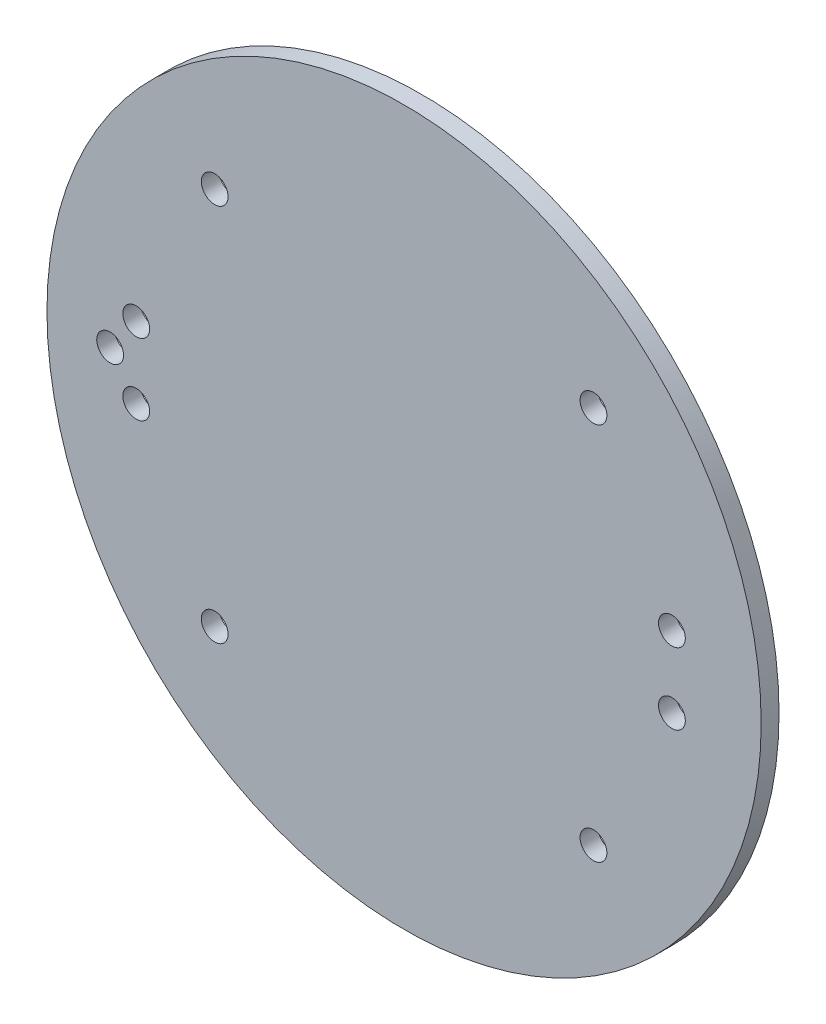
ISO-10303-21;
HEADER;
FILE_DESCRIPTION(('STEP AP214'),'2;1');
FILE_NAME('part.step','',(''),(''),'','','');
FILE_SCHEMA(('AUTOMOTIVE_DESIGN { 1 0 10303 214 1 1 1 1 }'));
ENDSEC;
DATA;
#1=APPLICATION_CONTEXT('core data for automotive mechanical design processes');
#2=APPLICATION_PROTOCOL_DEFINITION('international standard','automotive_design',2000,#1);
#3=PRODUCT_CONTEXT('',#1,'mechanical');
#4=PRODUCT('Part','Part','',(#3));
#5=PRODUCT_RELATED_PRODUCT_CATEGORY('part','',(#4));
#6=PRODUCT_DEFINITION_FORMATION('','',#4);
#7=PRODUCT_DEFINITION_CONTEXT('part definition',#1,'design');
#8=PRODUCT_DEFINITION('design','',#6,#7);
#9=PRODUCT_DEFINITION_SHAPE('','',#8);
#10=(LENGTH_UNIT() NAMED_UNIT(*) SI_UNIT(.MILLI.,.METRE.));
#11=(NAMED_UNIT(*) PLANE_ANGLE_UNIT() SI_UNIT($,.RADIAN.));
#12=(NAMED_UNIT(*) SI_UNIT($,.STERADIAN.) SOLID_ANGLE_UNIT());
#13=UNCERTAINTY_MEASURE_WITH_UNIT(LENGTH_MEASURE(1.E-05),#10,'distance_accuracy_value','');
#14=(GEOMETRIC_REPRESENTATION_CONTEXT(3) GLOBAL_UNCERTAINTY_ASSIGNED_CONTEXT((#13)) GLOBAL_UNIT_ASSIGNED_CONTEXT((#10,
#11,#12)) REPRESENTATION_CONTEXT('',''));
#15=CARTESIAN_POINT('',(0.,0.,0.));
#16=DIRECTION('',(0.,0.,1.));
#17=DIRECTION('',(1.,0.,0.));
#18=AXIS2_PLACEMENT_3D('',#15,#16,#17);
#19=CARTESIAN_POINT('',(0.,0.,6.35));
#20=DIRECTION('',(0.,0.,-1.));
#21=DIRECTION('',(-1.,0.,0.));
#22=AXIS2_PLACEMENT_3D('',#19,#20,#21);
#23=CYLINDRICAL_SURFACE('',#22,127.);
#24=CARTESIAN_POINT('',(0.,0.,6.35));
#25=DIRECTION('',(0.,0.,1.));
#26=DIRECTION('',(1.,0.,0.));
#27=AXIS2_PLACEMENT_3D('',#24,#25,#26);
#28=CIRCLE('',#27,127.);
#29=CARTESIAN_POINT('',(127.,0.,6.35));
#30=VERTEX_POINT('',#29);
#31=EDGE_CURVE('E10',#30,#30,#28,.T.);
#32=ORIENTED_EDGE('',*,*,#31,.F.);
#33=EDGE_LOOP('',(#32));
#34=FACE_BOUND('',#33,.T.);
#35=CARTESIAN_POINT('',(0.,0.,0.));
#36=DIRECTION('',(0.,0.,1.));
#37=DIRECTION('',(1.,0.,0.));
#38=AXIS2_PLACEMENT_3D('',#35,#36,#37);
#39=CIRCLE('',#38,127.);
#40=CARTESIAN_POINT('',(127.,0.,0.));
#41=VERTEX_POINT('',#40);
#42=EDGE_CURVE('E33',#41,#41,#39,.T.);
#43=ORIENTED_EDGE('',*,*,#42,.T.);
#44=EDGE_LOOP('',(#43));
#45=FACE_BOUND('',#44,.T.);
#46=ADVANCED_FACE('F30',(#34,#45),#23,.T.);
#47=CARTESIAN_POINT('',(0.,0.,6.35));
#48=DIRECTION('',(0.,0.,1.));
#49=DIRECTION('',(1.,0.,0.));
#50=AXIS2_PLACEMENT_3D('',#47,#48,#49);
#51=PLANE('',#50);
#52=CARTESIAN_POINT('',(-104.537500094,0.,6.35));
#53=DIRECTION('',(0.,0.,1.));
#54=DIRECTION('',(1.,0.,0.));
#55=AXIS2_PLACEMENT_3D('',#52,#53,#54);
#56=CIRCLE('',#55,4.7625);
#57=CARTESIAN_POINT('',(-99.775000094,0.,6.35));
#58=VERTEX_POINT('',#57);
#59=EDGE_CURVE('E85',#58,#58,#56,.T.);
#60=ORIENTED_EDGE('',*,*,#59,.F.);
#61=EDGE_LOOP('',(#60));
#62=FACE_BOUND('',#61,.T.);
#63=CARTESIAN_POINT('',(95.25,12.7,6.35));
#64=DIRECTION('',(0.,0.,1.));
#65=DIRECTION('',(1.,0.,0.));
#66=AXIS2_PLACEMENT_3D('',#63,#64,#65);
#67=CIRCLE('',#66,4.7625);
#68=CARTESIAN_POINT('',(100.0125,12.7,6.35));
#69=VERTEX_POINT('',#68);
#70=EDGE_CURVE('E61',#69,#69,#67,.T.);
#71=ORIENTED_EDGE('',*,*,#70,.F.);
#72=EDGE_LOOP('',(#71));
#73=FACE_BOUND('',#72,.T.);
#74=CARTESIAN_POINT('',(95.25,-12.7,6.35));
#75=DIRECTION('',(0.,0.,1.));
#76=DIRECTION('',(1.,0.,0.));
#77=AXIS2_PLACEMENT_3D('',#74,#75,#76);
#78=CIRCLE('',#77,4.7625);
#79=CARTESIAN_POINT('',(100.0125,-12.7,6.35));
#80=VERTEX_POINT('',#79);
#81=EDGE_CURVE('E68',#80,#80,#78,.T.);
#82=ORIENTED_EDGE('',*,*,#81,.F.);
#83=EDGE_LOOP('',(#82));
#84=FACE_BOUND('',#83,.T.);
#85=CARTESIAN_POINT('',(-95.25,-12.7,6.35));
#86=DIRECTION('',(0.,0.,1.));
#87=DIRECTION('',(1.,0.,0.));
#88=AXIS2_PLACEMENT_3D('',#85,#86,#87);
#89=CIRCLE('',#88,4.7625);
#90=CARTESIAN_POINT('',(-90.4875,-12.7,6.35));
#91=VERTEX_POINT('',#90);
#92=EDGE_CURVE('E71',#91,#91,#89,.T.);
#93=ORIENTED_EDGE('',*,*,#92,.F.);
#94=EDGE_LOOP('',(#93));
#95=FACE_BOUND('',#94,.T.);
#96=CARTESIAN_POINT('',(-95.25,12.7,6.35));
#97=DIRECTION('',(0.,0.,1.));
#98=DIRECTION('',(1.,0.,0.));
#99=AXIS2_PLACEMENT_3D('',#96,#97,#98);
#100=CIRCLE('',#99,4.7625);
#101=CARTESIAN_POINT('',(-90.4875,12.7,6.35));
#102=VERTEX_POINT('',#101);
#103=EDGE_CURVE('E74',#102,#102,#100,.T.);
#104=ORIENTED_EDGE('',*,*,#103,.F.);
#105=EDGE_LOOP('',(#104));
#106=FACE_BOUND('',#105,.T.);
#107=CARTESIAN_POINT('',(67.3519209080187,67.3519209080186,6.35));
#108=DIRECTION('',(0.,0.,1.));
#109=DIRECTION('',(1.,0.,0.));
#110=AXIS2_PLACEMENT_3D('',#107,#108,#109);
#111=CIRCLE('',#110,4.7625);
#112=CARTESIAN_POINT('',(72.1144209080186,67.3519209080186,6.35));
#113=VERTEX_POINT('',#112);
#114=EDGE_CURVE('E40',#113,#113,#111,.T.);
#115=ORIENTED_EDGE('',*,*,#114,.F.);
#116=EDGE_LOOP('',(#115));
#117=FACE_BOUND('',#116,.T.);
#118=CARTESIAN_POINT('',(67.3519209080187,-67.3519209080186,6.35));
#119=DIRECTION('',(0.,0.,1.));
#120=DIRECTION('',(1.,0.,0.));
#121=AXIS2_PLACEMENT_3D('',#118,#119,#120);
#122=CIRCLE('',#121,4.7625);
#123=CARTESIAN_POINT('',(72.1144209080186,-67.3519209080186,6.35));
#124=VERTEX_POINT('',#123);
#125=EDGE_CURVE('E44',#124,#124,#122,.T.);
#126=ORIENTED_EDGE('',*,*,#125,.F.);
#127=EDGE_LOOP('',(#126));
#128=FACE_BOUND('',#127,.T.);
#129=CARTESIAN_POINT('',(-67.3519209080187,-67.3519209080186,6.35));
#130=DIRECTION('',(0.,0.,1.));
#131=DIRECTION('',(1.,0.,0.));
#132=AXIS2_PLACEMENT_3D('',#129,#130,#131);
#133=CIRCLE('',#132,4.7625);
#134=CARTESIAN_POINT('',(-62.5894209080187,-67.3519209080186,6.35));
#135=VERTEX_POINT('',#134);
#136=EDGE_CURVE('E47',#135,#135,#133,.T.);
#137=ORIENTED_EDGE('',*,*,#136,.F.);
#138=EDGE_LOOP('',(#137));
#139=FACE_BOUND('',#138,.T.);
#140=CARTESIAN_POINT('',(-67.3519209080187,67.3519209080186,6.35));
#141=DIRECTION('',(0.,0.,1.));
#142=DIRECTION('',(1.,0.,0.));
#143=AXIS2_PLACEMENT_3D('',#140,#141,#142);
#144=CIRCLE('',#143,4.7625);
#145=CARTESIAN_POINT('',(-62.5894209080187,67.3519209080186,6.35));
#146=VERTEX_POINT('',#145);
#147=EDGE_CURVE('E50',#146,#146,#144,.T.);
#148=ORIENTED_EDGE('',*,*,#147,.F.);
#149=EDGE_LOOP('',(#148));
#150=FACE_BOUND('',#149,.T.);
#151=ORIENTED_EDGE('',*,*,#31,.T.);
#152=EDGE_LOOP('',(#151));
#153=FACE_BOUND('',#152,.T.);
#154=ADVANCED_FACE('F112',(#62,#73,#84,#95,#106,#117,#128,#139,#150,#153),#51,.T.);
#155=CARTESIAN_POINT('',(0.,0.,0.));
#156=DIRECTION('',(0.,0.,1.));
#157=DIRECTION('',(1.,0.,0.));
#158=AXIS2_PLACEMENT_3D('',#155,#156,#157);
#159=PLANE('',#158);
#160=CARTESIAN_POINT('',(-104.537500094,0.,0.));
#161=DIRECTION('',(0.,0.,1.));
#162=DIRECTION('',(1.,0.,0.));
#163=AXIS2_PLACEMENT_3D('',#160,#161,#162);
#164=CIRCLE('',#163,4.7625);
#165=CARTESIAN_POINT('',(-99.775000094,0.,0.));
#166=VERTEX_POINT('',#165);
#167=EDGE_CURVE('E92',#166,#166,#164,.T.);
#168=ORIENTED_EDGE('',*,*,#167,.T.);
#169=EDGE_LOOP('',(#168));
#170=FACE_BOUND('',#169,.T.);
#171=CARTESIAN_POINT('',(95.25,12.7,0.));
#172=DIRECTION('',(0.,0.,1.));
#173=DIRECTION('',(-1.,0.,0.));
#174=AXIS2_PLACEMENT_3D('',#171,#172,#173);
#175=CIRCLE('',#174,4.7625);
#176=CARTESIAN_POINT('',(90.4875,12.7,0.));
#177=VERTEX_POINT('',#176);
#178=EDGE_CURVE('E81',#177,#177,#175,.T.);
#179=ORIENTED_EDGE('',*,*,#178,.T.);
#180=EDGE_LOOP('',(#179));
#181=FACE_BOUND('',#180,.T.);
#182=CARTESIAN_POINT('',(95.25,-12.7,0.));
#183=DIRECTION('',(0.,0.,1.));
#184=DIRECTION('',(1.,0.,0.));
#185=AXIS2_PLACEMENT_3D('',#182,#183,#184);
#186=CIRCLE('',#185,4.7625);
#187=CARTESIAN_POINT('',(100.0125,-12.7,0.));
#188=VERTEX_POINT('',#187);
#189=EDGE_CURVE('E84',#188,#188,#186,.T.);
#190=ORIENTED_EDGE('',*,*,#189,.T.);
#191=EDGE_LOOP('',(#190));
#192=FACE_BOUND('',#191,.T.);
#193=CARTESIAN_POINT('',(-95.25,-12.7,0.));
#194=DIRECTION('',(0.,0.,1.));
#195=DIRECTION('',(-1.,0.,0.));
#196=AXIS2_PLACEMENT_3D('',#193,#194,#195);
#197=CIRCLE('',#196,4.7625);
#198=CARTESIAN_POINT('',(-100.0125,-12.7,0.));
#199=VERTEX_POINT('',#198);
#200=EDGE_CURVE('E80',#199,#199,#197,.T.);
#201=ORIENTED_EDGE('',*,*,#200,.T.);
#202=EDGE_LOOP('',(#201));
#203=FACE_BOUND('',#202,.T.);
#204=CARTESIAN_POINT('',(-95.25,12.7,0.));
#205=DIRECTION('',(0.,0.,1.));
#206=DIRECTION('',(1.,0.,0.));
#207=AXIS2_PLACEMENT_3D('',#204,#205,#206);
#208=CIRCLE('',#207,4.7625);
#209=CARTESIAN_POINT('',(-90.4875,12.7,0.));
#210=VERTEX_POINT('',#209);
#211=EDGE_CURVE('E77',#210,#210,#208,.T.);
#212=ORIENTED_EDGE('',*,*,#211,.T.);
#213=EDGE_LOOP('',(#212));
#214=FACE_BOUND('',#213,.T.);
#215=CARTESIAN_POINT('',(67.3519209080187,67.3519209080186,0.));
#216=DIRECTION('',(0.,0.,1.));
#217=DIRECTION('',(-1.,0.,0.));
#218=AXIS2_PLACEMENT_3D('',#215,#216,#217);
#219=CIRCLE('',#218,4.7625);
#220=CARTESIAN_POINT('',(62.5894209080187,67.3519209080186,0.));
#221=VERTEX_POINT('',#220);
#222=EDGE_CURVE('E57',#221,#221,#219,.T.);
#223=ORIENTED_EDGE('',*,*,#222,.T.);
#224=EDGE_LOOP('',(#223));
#225=FACE_BOUND('',#224,.T.);
#226=CARTESIAN_POINT('',(67.3519209080187,-67.3519209080186,0.));
#227=DIRECTION('',(0.,0.,1.));
#228=DIRECTION('',(1.,0.,0.));
#229=AXIS2_PLACEMENT_3D('',#226,#227,#228);
#230=CIRCLE('',#229,4.7625);
#231=CARTESIAN_POINT('',(72.1144209080186,-67.3519209080186,0.));
#232=VERTEX_POINT('',#231);
#233=EDGE_CURVE('E60',#232,#232,#230,.T.);
#234=ORIENTED_EDGE('',*,*,#233,.T.);
#235=EDGE_LOOP('',(#234));
#236=FACE_BOUND('',#235,.T.);
#237=CARTESIAN_POINT('',(-67.3519209080187,-67.3519209080186,0.));
#238=DIRECTION('',(0.,0.,1.));
#239=DIRECTION('',(-1.,0.,0.));
#240=AXIS2_PLACEMENT_3D('',#237,#238,#239);
#241=CIRCLE('',#240,4.7625);
#242=CARTESIAN_POINT('',(-72.1144209080186,-67.3519209080186,0.));
#243=VERTEX_POINT('',#242);
#244=EDGE_CURVE('E56',#243,#243,#241,.T.);
#245=ORIENTED_EDGE('',*,*,#244,.T.);
#246=EDGE_LOOP('',(#245));
#247=FACE_BOUND('',#246,.T.);
#248=CARTESIAN_POINT('',(-67.3519209080187,67.3519209080186,0.));
#249=DIRECTION('',(0.,0.,1.));
#250=DIRECTION('',(1.,0.,0.));
#251=AXIS2_PLACEMENT_3D('',#248,#249,#250);
#252=CIRCLE('',#251,4.7625);
#253=CARTESIAN_POINT('',(-62.5894209080187,67.3519209080186,0.));
#254=VERTEX_POINT('',#253);
#255=EDGE_CURVE('E53',#254,#254,#252,.T.);
#256=ORIENTED_EDGE('',*,*,#255,.T.);
#257=EDGE_LOOP('',(#256));
#258=FACE_BOUND('',#257,.T.);
#259=ORIENTED_EDGE('',*,*,#42,.F.);
#260=EDGE_LOOP('',(#259));
#261=FACE_BOUND('',#260,.T.);
#262=ADVANCED_FACE('F96',(#170,#181,#192,#203,#214,#225,#236,#247,#258,#261),#159,.F.);
#263=CARTESIAN_POINT('',(-67.3519209080187,67.3519209080186,0.));
#264=DIRECTION('',(0.,0.,1.));
#265=DIRECTION('',(1.,0.,0.));
#266=AXIS2_PLACEMENT_3D('',#263,#264,#265);
#267=CYLINDRICAL_SURFACE('',#266,4.7625);
#268=ORIENTED_EDGE('',*,*,#147,.T.);
#269=EDGE_LOOP('',(#268));
#270=FACE_BOUND('',#269,.T.);
#271=ORIENTED_EDGE('',*,*,#255,.F.);
#272=EDGE_LOOP('',(#271));
#273=FACE_BOUND('',#272,.T.);
#274=ADVANCED_FACE('F123',(#270,#273),#267,.F.);
#275=CARTESIAN_POINT('',(-67.3519209080187,-67.3519209080186,0.));
#276=DIRECTION('',(0.,0.,1.));
#277=DIRECTION('',(1.,0.,0.));
#278=AXIS2_PLACEMENT_3D('',#275,#276,#277);
#279=CYLINDRICAL_SURFACE('',#278,4.7625);
#280=ORIENTED_EDGE('',*,*,#136,.T.);
#281=EDGE_LOOP('',(#280));
#282=FACE_BOUND('',#281,.T.);
#283=ORIENTED_EDGE('',*,*,#244,.F.);
#284=EDGE_LOOP('',(#283));
#285=FACE_BOUND('',#284,.T.);
#286=ADVANCED_FACE('F127',(#282,#285),#279,.F.);
#287=CARTESIAN_POINT('',(67.3519209080187,-67.3519209080186,0.));
#288=DIRECTION('',(0.,0.,1.));
#289=DIRECTION('',(1.,0.,0.));
#290=AXIS2_PLACEMENT_3D('',#287,#288,#289);
#291=CYLINDRICAL_SURFACE('',#290,4.7625);
#292=ORIENTED_EDGE('',*,*,#125,.T.);
#293=EDGE_LOOP('',(#292));
#294=FACE_BOUND('',#293,.T.);
#295=ORIENTED_EDGE('',*,*,#233,.F.);
#296=EDGE_LOOP('',(#295));
#297=FACE_BOUND('',#296,.T.);
#298=ADVANCED_FACE('F135',(#294,#297),#291,.F.);
#299=CARTESIAN_POINT('',(67.3519209080187,67.3519209080186,0.));
#300=DIRECTION('',(0.,0.,1.));
#301=DIRECTION('',(1.,0.,0.));
#302=AXIS2_PLACEMENT_3D('',#299,#300,#301);
#303=CYLINDRICAL_SURFACE('',#302,4.7625);
#304=ORIENTED_EDGE('',*,*,#114,.T.);
#305=EDGE_LOOP('',(#304));
#306=FACE_BOUND('',#305,.T.);
#307=ORIENTED_EDGE('',*,*,#222,.F.);
#308=EDGE_LOOP('',(#307));
#309=FACE_BOUND('',#308,.T.);
#310=ADVANCED_FACE('F131',(#306,#309),#303,.F.);
#311=CARTESIAN_POINT('',(-95.25,12.7,0.));
#312=DIRECTION('',(0.,0.,1.));
#313=DIRECTION('',(1.,0.,0.));
#314=AXIS2_PLACEMENT_3D('',#311,#312,#313);
#315=CYLINDRICAL_SURFACE('',#314,4.7625);
#316=ORIENTED_EDGE('',*,*,#103,.T.);
#317=EDGE_LOOP('',(#316));
#318=FACE_BOUND('',#317,.T.);
#319=ORIENTED_EDGE('',*,*,#211,.F.);
#320=EDGE_LOOP('',(#319));
#321=FACE_BOUND('',#320,.T.);
#322=ADVANCED_FACE('F134',(#318,#321),#315,.F.);
#323=CARTESIAN_POINT('',(-95.25,-12.7,0.));
#324=DIRECTION('',(0.,0.,1.));
#325=DIRECTION('',(1.,0.,0.));
#326=AXIS2_PLACEMENT_3D('',#323,#324,#325);
#327=CYLINDRICAL_SURFACE('',#326,4.7625);
#328=ORIENTED_EDGE('',*,*,#92,.T.);
#329=EDGE_LOOP('',(#328));
#330=FACE_BOUND('',#329,.T.);
#331=ORIENTED_EDGE('',*,*,#200,.F.);
#332=EDGE_LOOP('',(#331));
#333=FACE_BOUND('',#332,.T.);
#334=ADVANCED_FACE('F144',(#330,#333),#327,.F.);
#335=CARTESIAN_POINT('',(95.25,-12.7,0.));
#336=DIRECTION('',(0.,0.,1.));
#337=DIRECTION('',(1.,0.,0.));
#338=AXIS2_PLACEMENT_3D('',#335,#336,#337);
#339=CYLINDRICAL_SURFACE('',#338,4.7625);
#340=ORIENTED_EDGE('',*,*,#81,.T.);
#341=EDGE_LOOP('',(#340));
#342=FACE_BOUND('',#341,.T.);
#343=ORIENTED_EDGE('',*,*,#189,.F.);
#344=EDGE_LOOP('',(#343));
#345=FACE_BOUND('',#344,.T.);
#346=ADVANCED_FACE('F107',(#342,#345),#339,.F.);
#347=CARTESIAN_POINT('',(95.25,12.7,0.));
#348=DIRECTION('',(0.,0.,1.));
#349=DIRECTION('',(1.,0.,0.));
#350=AXIS2_PLACEMENT_3D('',#347,#348,#349);
#351=CYLINDRICAL_SURFACE('',#350,4.7625);
#352=ORIENTED_EDGE('',*,*,#70,.T.);
#353=EDGE_LOOP('',(#352));
#354=FACE_BOUND('',#353,.T.);
#355=ORIENTED_EDGE('',*,*,#178,.F.);
#356=EDGE_LOOP('',(#355));
#357=FACE_BOUND('',#356,.T.);
#358=ADVANCED_FACE('F101',(#354,#357),#351,.F.);
#359=CARTESIAN_POINT('',(-104.537500094,0.,0.));
#360=DIRECTION('',(0.,0.,1.));
#361=DIRECTION('',(1.,0.,0.));
#362=AXIS2_PLACEMENT_3D('',#359,#360,#361);
#363=CYLINDRICAL_SURFACE('',#362,4.7625);
#364=ORIENTED_EDGE('',*,*,#59,.T.);
#365=EDGE_LOOP('',(#364));
#366=FACE_BOUND('',#365,.T.);
#367=ORIENTED_EDGE('',*,*,#167,.F.);
#368=EDGE_LOOP('',(#367));
#369=FACE_BOUND('',#368,.T.);
#370=ADVANCED_FACE('F99',(#366,#369),#363,.F.);
#371=CLOSED_SHELL('',(#46,#154,#262,#274,#286,#298,#310,#322,#334,#346,#358,#370));
#372=MANIFOLD_SOLID_BREP('B2',#371);
#373=ADVANCED_BREP_SHAPE_REPRESENTATION('',(#18,#372),#14);
#374=SHAPE_DEFINITION_REPRESENTATION(#9,#373);
ENDSEC;
END-ISO-10303-21;
